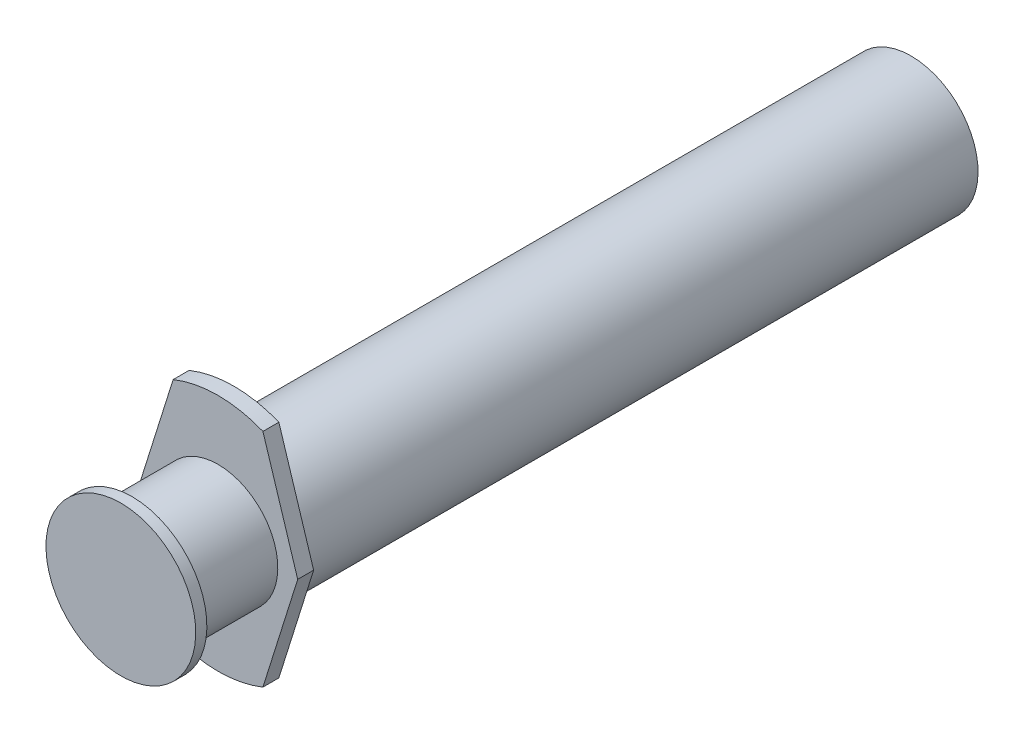
ISO-10303-21;
HEADER;
FILE_DESCRIPTION(('STEP AP214'),'2;1');
FILE_NAME('part.step','',(''),(''),'','','');
FILE_SCHEMA(('AUTOMOTIVE_DESIGN { 1 0 10303 214 1 1 1 1 }'));
ENDSEC;
DATA;
#1=APPLICATION_CONTEXT('core data for automotive mechanical design processes');
#2=APPLICATION_PROTOCOL_DEFINITION('international standard','automotive_design',2000,#1);
#3=PRODUCT_CONTEXT('',#1,'mechanical');
#4=PRODUCT('Part','Part','',(#3));
#5=PRODUCT_RELATED_PRODUCT_CATEGORY('part','',(#4));
#6=PRODUCT_DEFINITION_FORMATION('','',#4);
#7=PRODUCT_DEFINITION_CONTEXT('part definition',#1,'design');
#8=PRODUCT_DEFINITION('design','',#6,#7);
#9=PRODUCT_DEFINITION_SHAPE('','',#8);
#10=(LENGTH_UNIT() NAMED_UNIT(*) SI_UNIT(.MILLI.,.METRE.));
#11=(NAMED_UNIT(*) PLANE_ANGLE_UNIT() SI_UNIT($,.RADIAN.));
#12=(NAMED_UNIT(*) SI_UNIT($,.STERADIAN.) SOLID_ANGLE_UNIT());
#13=UNCERTAINTY_MEASURE_WITH_UNIT(LENGTH_MEASURE(1.E-05),#10,'distance_accuracy_value','');
#14=(GEOMETRIC_REPRESENTATION_CONTEXT(3) GLOBAL_UNCERTAINTY_ASSIGNED_CONTEXT((#13)) GLOBAL_UNIT_ASSIGNED_CONTEXT((#10,
#11,#12)) REPRESENTATION_CONTEXT('',''));
#15=CARTESIAN_POINT('',(0.,0.,0.));
#16=DIRECTION('',(0.,0.,1.));
#17=DIRECTION('',(1.,0.,0.));
#18=AXIS2_PLACEMENT_3D('',#15,#16,#17);
#19=CARTESIAN_POINT('',(0.,0.,-125.984));
#20=DIRECTION('',(0.,0.,-1.));
#21=DIRECTION('',(0.,1.,0.));
#22=AXIS2_PLACEMENT_3D('',#19,#20,#21);
#23=CYLINDRICAL_SURFACE('',#22,19.05);
#24=CARTESIAN_POINT('',(0.,0.,-18.034));
#25=DIRECTION('',(0.,0.,-1.));
#26=DIRECTION('',(0.,1.,0.));
#27=AXIS2_PLACEMENT_3D('',#24,#25,#26);
#28=CIRCLE('',#27,19.05);
#29=CARTESIAN_POINT('',(7.15625989359732,-17.6547569888484,-18.034));
#30=VERTEX_POINT('',#29);
#31=CARTESIAN_POINT('',(-7.15625989359732,-17.6547569888484,-18.034));
#32=VERTEX_POINT('',#31);
#33=EDGE_CURVE('E134',#30,#32,#28,.T.);
#34=ORIENTED_EDGE('',*,*,#33,.F.);
#35=DIRECTION('',(0.,0.,-1.));
#36=VECTOR('',#35,1.);
#37=CARTESIAN_POINT('',(7.15625989359733,-17.6547569888483,-125.984));
#38=LINE('',#37,#36);
#39=CARTESIAN_POINT('',(7.15625989359732,-17.6547569888483,-15.494));
#40=VERTEX_POINT('',#39);
#41=EDGE_CURVE('E82',#30,#40,#38,.F.);
#42=ORIENTED_EDGE('',*,*,#41,.T.);
#43=CARTESIAN_POINT('',(0.,0.,-15.494));
#44=DIRECTION('',(0.,0.,-1.));
#45=DIRECTION('',(0.,1.,0.));
#46=AXIS2_PLACEMENT_3D('',#43,#44,#45);
#47=CIRCLE('',#46,19.05);
#48=CARTESIAN_POINT('',(-7.15625989359732,-17.6547569888484,-15.494));
#49=VERTEX_POINT('',#48);
#50=EDGE_CURVE('E145',#40,#49,#47,.T.);
#51=ORIENTED_EDGE('',*,*,#50,.T.);
#52=DIRECTION('',(0.,0.,-1.));
#53=VECTOR('',#52,1.);
#54=CARTESIAN_POINT('',(-7.15625989359733,-17.6547569888483,-125.984));
#55=LINE('',#54,#53);
#56=EDGE_CURVE('E123',#49,#32,#55,.T.);
#57=ORIENTED_EDGE('',*,*,#56,.T.);
#58=EDGE_LOOP('',(#34,#42,#51,#57));
#59=FACE_BOUND('',#58,.T.);
#60=ADVANCED_FACE('F59',(#59),#23,.T.);
#61=CARTESIAN_POINT('',(0.,0.,0.));
#62=DIRECTION('',(0.,0.,1.));
#63=DIRECTION('',(0.,-1.,0.));
#64=AXIS2_PLACEMENT_3D('',#61,#62,#63);
#65=PLANE('',#64);
#66=CARTESIAN_POINT('',(0.,0.,0.));
#67=DIRECTION('',(0.,0.,-1.));
#68=DIRECTION('',(0.,1.,0.));
#69=AXIS2_PLACEMENT_3D('',#66,#67,#68);
#70=CIRCLE('',#69,11.938);
#71=CARTESIAN_POINT('',(0.,11.938,0.));
#72=VERTEX_POINT('',#71);
#73=EDGE_CURVE('E117',#72,#72,#70,.T.);
#74=ORIENTED_EDGE('',*,*,#73,.F.);
#75=EDGE_LOOP('',(#74));
#76=FACE_BOUND('',#75,.T.);
#77=ADVANCED_FACE('F61',(#76),#65,.T.);
#78=CARTESIAN_POINT('',(0.,0.,-125.984));
#79=DIRECTION('',(0.,0.,-1.));
#80=DIRECTION('',(0.,1.,0.));
#81=AXIS2_PLACEMENT_3D('',#78,#79,#80);
#82=CYLINDRICAL_SURFACE('',#81,11.938);
#83=ORIENTED_EDGE('',*,*,#73,.T.);
#84=EDGE_LOOP('',(#83));
#85=FACE_BOUND('',#84,.T.);
#86=CARTESIAN_POINT('',(0.,0.,-1.778));
#87=DIRECTION('',(0.,0.,-1.));
#88=DIRECTION('',(0.,1.,0.));
#89=AXIS2_PLACEMENT_3D('',#86,#87,#88);
#90=CIRCLE('',#89,11.938);
#91=CARTESIAN_POINT('',(0.,11.938,-1.778));
#92=VERTEX_POINT('',#91);
#93=EDGE_CURVE('E152',#92,#92,#90,.T.);
#94=ORIENTED_EDGE('',*,*,#93,.F.);
#95=EDGE_LOOP('',(#94));
#96=FACE_BOUND('',#95,.T.);
#97=ADVANCED_FACE('F158',(#85,#96),#82,.T.);
#98=CARTESIAN_POINT('',(0.,11.938,-1.778));
#99=DIRECTION('',(0.,0.,-1.));
#100=DIRECTION('',(0.,1.,0.));
#101=AXIS2_PLACEMENT_3D('',#98,#99,#100);
#102=PLANE('',#101);
#103=ORIENTED_EDGE('',*,*,#93,.T.);
#104=EDGE_LOOP('',(#103));
#105=FACE_BOUND('',#104,.T.);
#106=CARTESIAN_POINT('',(0.,0.,-1.778));
#107=DIRECTION('',(0.,0.,-1.));
#108=DIRECTION('',(0.,1.,0.));
#109=AXIS2_PLACEMENT_3D('',#106,#107,#108);
#110=CIRCLE('',#109,9.52499999999998);
#111=CARTESIAN_POINT('',(0.,9.52499999999998,-1.778));
#112=VERTEX_POINT('',#111);
#113=EDGE_CURVE('E149',#112,#112,#110,.T.);
#114=ORIENTED_EDGE('',*,*,#113,.F.);
#115=EDGE_LOOP('',(#114));
#116=FACE_BOUND('',#115,.T.);
#117=ADVANCED_FACE('F166',(#105,#116),#102,.T.);
#118=CARTESIAN_POINT('',(0.,0.,-125.984));
#119=DIRECTION('',(0.,0.,-1.));
#120=DIRECTION('',(0.,1.,0.));
#121=AXIS2_PLACEMENT_3D('',#118,#119,#120);
#122=CYLINDRICAL_SURFACE('',#121,9.52499999999998);
#123=ORIENTED_EDGE('',*,*,#113,.T.);
#124=EDGE_LOOP('',(#123));
#125=FACE_BOUND('',#124,.T.);
#126=CARTESIAN_POINT('',(0.,0.,-15.494));
#127=DIRECTION('',(0.,0.,-1.));
#128=DIRECTION('',(0.,1.,0.));
#129=AXIS2_PLACEMENT_3D('',#126,#127,#128);
#130=CIRCLE('',#129,9.52499999999998);
#131=CARTESIAN_POINT('',(0.,9.52499999999999,-15.494));
#132=VERTEX_POINT('',#131);
#133=EDGE_CURVE('E146',#132,#132,#130,.T.);
#134=ORIENTED_EDGE('',*,*,#133,.F.);
#135=EDGE_LOOP('',(#134));
#136=FACE_BOUND('',#135,.T.);
#137=ADVANCED_FACE('F181',(#125,#136),#122,.T.);
#138=CARTESIAN_POINT('',(0.,9.52499999999998,-15.494));
#139=DIRECTION('',(0.,0.,1.));
#140=DIRECTION('',(0.,-1.,0.));
#141=AXIS2_PLACEMENT_3D('',#138,#139,#140);
#142=PLANE('',#141);
#143=DIRECTION('',(0.299585701668378,-0.954069393365003,0.));
#144=VECTOR('',#143,1.);
#145=CARTESIAN_POINT('',(0.,40.4447916848445,-15.494));
#146=LINE('',#145,#144);
#147=CARTESIAN_POINT('',(7.15625989359732,17.6547569888484,-15.494));
#148=VERTEX_POINT('',#147);
#149=CARTESIAN_POINT('',(12.7,0.,-15.494));
#150=VERTEX_POINT('',#149);
#151=EDGE_CURVE('E122',#148,#150,#146,.T.);
#152=ORIENTED_EDGE('',*,*,#151,.F.);
#153=CARTESIAN_POINT('',(-7.15625989359732,17.6547569888484,-15.494));
#154=VERTEX_POINT('',#153);
#155=EDGE_CURVE('E137',#154,#148,#47,.T.);
#156=ORIENTED_EDGE('',*,*,#155,.F.);
#157=DIRECTION('',(0.299585701668378,0.954069393365003,0.));
#158=VECTOR('',#157,1.);
#159=CARTESIAN_POINT('',(-12.7,0.,-15.494));
#160=LINE('',#159,#158);
#161=CARTESIAN_POINT('',(-12.7,0.,-15.494));
#162=VERTEX_POINT('',#161);
#163=EDGE_CURVE('E190',#162,#154,#160,.T.);
#164=ORIENTED_EDGE('',*,*,#163,.F.);
#165=DIRECTION('',(0.299585701668378,-0.954069393365003,0.));
#166=VECTOR('',#165,1.);
#167=CARTESIAN_POINT('',(-12.7,0.,-15.494));
#168=LINE('',#167,#166);
#169=EDGE_CURVE('E194',#162,#49,#168,.T.);
#170=ORIENTED_EDGE('',*,*,#169,.T.);
#171=ORIENTED_EDGE('',*,*,#50,.F.);
#172=DIRECTION('',(0.299585701668378,0.954069393365003,0.));
#173=VECTOR('',#172,1.);
#174=CARTESIAN_POINT('',(0.,-40.4447916848445,-15.494));
#175=LINE('',#174,#173);
#176=EDGE_CURVE('E192',#40,#150,#175,.T.);
#177=ORIENTED_EDGE('',*,*,#176,.T.);
#178=EDGE_LOOP('',(#152,#156,#164,#170,#171,#177));
#179=FACE_BOUND('',#178,.T.);
#180=ORIENTED_EDGE('',*,*,#133,.T.);
#181=EDGE_LOOP('',(#180));
#182=FACE_BOUND('',#181,.T.);
#183=ADVANCED_FACE('F175',(#179,#182),#142,.T.);
#184=DIRECTION('',(0.,0.,-1.));
#185=VECTOR('',#184,1.);
#186=CARTESIAN_POINT('',(-7.1562598935973,17.6547569888484,-125.984));
#187=LINE('',#186,#185);
#188=CARTESIAN_POINT('',(-7.15625989359732,17.6547569888484,-18.034));
#189=VERTEX_POINT('',#188);
#190=EDGE_CURVE('E183',#154,#189,#187,.T.);
#191=ORIENTED_EDGE('',*,*,#190,.F.);
#192=ORIENTED_EDGE('',*,*,#155,.T.);
#193=DIRECTION('',(0.,0.,-1.));
#194=VECTOR('',#193,1.);
#195=CARTESIAN_POINT('',(7.15625989359731,17.6547569888484,-125.984));
#196=LINE('',#195,#194);
#197=CARTESIAN_POINT('',(7.15625989359732,17.6547569888484,-18.034));
#198=VERTEX_POINT('',#197);
#199=EDGE_CURVE('E185',#198,#148,#196,.F.);
#200=ORIENTED_EDGE('',*,*,#199,.F.);
#201=EDGE_CURVE('E130',#189,#198,#28,.T.);
#202=ORIENTED_EDGE('',*,*,#201,.F.);
#203=EDGE_LOOP('',(#191,#192,#200,#202));
#204=FACE_BOUND('',#203,.T.);
#205=ADVANCED_FACE('F169',(#204),#23,.T.);
#206=CARTESIAN_POINT('',(0.,19.05,-18.034));
#207=DIRECTION('',(0.,0.,-1.));
#208=DIRECTION('',(0.,1.,0.));
#209=AXIS2_PLACEMENT_3D('',#206,#207,#208);
#210=PLANE('',#209);
#211=DIRECTION('',(-0.299585701668378,0.954069393365003,0.));
#212=VECTOR('',#211,1.);
#213=CARTESIAN_POINT('',(6.11517807160692,20.9702166280043,-18.034));
#214=LINE('',#213,#212);
#215=CARTESIAN_POINT('',(12.7,0.,-18.034));
#216=VERTEX_POINT('',#215);
#217=EDGE_CURVE('E13',#216,#198,#214,.T.);
#218=ORIENTED_EDGE('',*,*,#217,.F.);
#219=DIRECTION('',(-0.299585701668378,-0.954069393365003,0.));
#220=VECTOR('',#219,1.);
#221=CARTESIAN_POINT('',(17.0051314752321,13.7102476922542,-18.034));
#222=LINE('',#221,#220);
#223=EDGE_CURVE('E67',#216,#30,#222,.T.);
#224=ORIENTED_EDGE('',*,*,#223,.T.);
#225=ORIENTED_EDGE('',*,*,#33,.T.);
#226=DIRECTION('',(0.299585701668378,-0.954069393365003,0.));
#227=VECTOR('',#226,1.);
#228=CARTESIAN_POINT('',(-12.7,0.,-18.034));
#229=LINE('',#228,#227);
#230=CARTESIAN_POINT('',(-12.7,0.,-18.034));
#231=VERTEX_POINT('',#230);
#232=EDGE_CURVE('E200',#231,#32,#229,.T.);
#233=ORIENTED_EDGE('',*,*,#232,.F.);
#234=DIRECTION('',(0.299585701668378,0.954069393365003,0.));
#235=VECTOR('',#234,1.);
#236=CARTESIAN_POINT('',(-12.7,0.,-18.034));
#237=LINE('',#236,#235);
#238=EDGE_CURVE('E74',#231,#189,#237,.T.);
#239=ORIENTED_EDGE('',*,*,#238,.T.);
#240=ORIENTED_EDGE('',*,*,#201,.T.);
#241=EDGE_LOOP('',(#218,#224,#225,#233,#239,#240));
#242=FACE_BOUND('',#241,.T.);
#243=CARTESIAN_POINT('',(0.,0.,-18.034));
#244=DIRECTION('',(0.,0.,-1.));
#245=DIRECTION('',(0.,1.,0.));
#246=AXIS2_PLACEMENT_3D('',#243,#244,#245);
#247=CIRCLE('',#246,10.668);
#248=CARTESIAN_POINT('',(0.,10.668,-18.034));
#249=VERTEX_POINT('',#248);
#250=EDGE_CURVE('E135',#249,#249,#247,.T.);
#251=ORIENTED_EDGE('',*,*,#250,.F.);
#252=EDGE_LOOP('',(#251));
#253=FACE_BOUND('',#252,.T.);
#254=ADVANCED_FACE('F127',(#242,#253),#210,.T.);
#255=CARTESIAN_POINT('',(0.,0.,-125.984));
#256=DIRECTION('',(0.,0.,-1.));
#257=DIRECTION('',(0.,1.,0.));
#258=AXIS2_PLACEMENT_3D('',#255,#256,#257);
#259=CYLINDRICAL_SURFACE('',#258,10.668);
#260=ORIENTED_EDGE('',*,*,#250,.T.);
#261=EDGE_LOOP('',(#260));
#262=FACE_BOUND('',#261,.T.);
#263=CARTESIAN_POINT('',(0.,0.,-125.984));
#264=DIRECTION('',(0.,0.,-1.));
#265=DIRECTION('',(0.,1.,0.));
#266=AXIS2_PLACEMENT_3D('',#263,#264,#265);
#267=CIRCLE('',#266,10.668);
#268=CARTESIAN_POINT('',(0.,10.668,-125.984));
#269=VERTEX_POINT('',#268);
#270=EDGE_CURVE('E139',#269,#269,#267,.T.);
#271=ORIENTED_EDGE('',*,*,#270,.F.);
#272=EDGE_LOOP('',(#271));
#273=FACE_BOUND('',#272,.T.);
#274=ADVANCED_FACE('F180',(#262,#273),#259,.T.);
#275=CARTESIAN_POINT('',(0.,10.668,-125.984));
#276=DIRECTION('',(0.,0.,-1.));
#277=DIRECTION('',(0.,1.,0.));
#278=AXIS2_PLACEMENT_3D('',#275,#276,#277);
#279=PLANE('',#278);
#280=ORIENTED_EDGE('',*,*,#270,.T.);
#281=EDGE_LOOP('',(#280));
#282=FACE_BOUND('',#281,.T.);
#283=ADVANCED_FACE('F208',(#282),#279,.T.);
#284=CARTESIAN_POINT('',(-12.7,0.,-18.034));
#285=DIRECTION('',(-0.954069393365003,-0.299585701668378,0.));
#286=DIRECTION('',(0.299585701668378,-0.954069393365003,0.));
#287=AXIS2_PLACEMENT_3D('',#284,#285,#286);
#288=PLANE('',#287);
#289=ORIENTED_EDGE('',*,*,#169,.F.);
#290=DIRECTION('',(0.,0.,1.));
#291=VECTOR('',#290,1.);
#292=CARTESIAN_POINT('',(-12.7,0.,-18.034));
#293=LINE('',#292,#291);
#294=EDGE_CURVE('E124',#231,#162,#293,.T.);
#295=ORIENTED_EDGE('',*,*,#294,.F.);
#296=ORIENTED_EDGE('',*,*,#232,.T.);
#297=ORIENTED_EDGE('',*,*,#56,.F.);
#298=EDGE_LOOP('',(#289,#295,#296,#297));
#299=FACE_BOUND('',#298,.T.);
#300=ADVANCED_FACE('F216',(#299),#288,.T.);
#301=CARTESIAN_POINT('',(-12.7,0.,-18.034));
#302=DIRECTION('',(0.954069393365003,-0.299585701668378,0.));
#303=DIRECTION('',(0.299585701668378,0.954069393365003,0.));
#304=AXIS2_PLACEMENT_3D('',#301,#302,#303);
#305=PLANE('',#304);
#306=ORIENTED_EDGE('',*,*,#190,.T.);
#307=ORIENTED_EDGE('',*,*,#238,.F.);
#308=ORIENTED_EDGE('',*,*,#294,.T.);
#309=ORIENTED_EDGE('',*,*,#163,.T.);
#310=EDGE_LOOP('',(#306,#307,#308,#309));
#311=FACE_BOUND('',#310,.T.);
#312=ADVANCED_FACE('F219',(#311),#305,.F.);
#313=CARTESIAN_POINT('',(0.,40.4447916848445,-18.034));
#314=DIRECTION('',(-0.954069393365003,-0.299585701668378,0.));
#315=DIRECTION('',(0.299585701668378,-0.954069393365003,0.));
#316=AXIS2_PLACEMENT_3D('',#313,#314,#315);
#317=PLANE('',#316);
#318=ORIENTED_EDGE('',*,*,#199,.T.);
#319=ORIENTED_EDGE('',*,*,#151,.T.);
#320=DIRECTION('',(0.,0.,1.));
#321=VECTOR('',#320,1.);
#322=CARTESIAN_POINT('',(12.7,0.,-18.034));
#323=LINE('',#322,#321);
#324=EDGE_CURVE('E111',#216,#150,#323,.T.);
#325=ORIENTED_EDGE('',*,*,#324,.F.);
#326=ORIENTED_EDGE('',*,*,#217,.T.);
#327=EDGE_LOOP('',(#318,#319,#325,#326));
#328=FACE_BOUND('',#327,.T.);
#329=ADVANCED_FACE('F119',(#328),#317,.F.);
#330=CARTESIAN_POINT('',(0.,-40.4447916848445,-18.034));
#331=DIRECTION('',(0.954069393365003,-0.299585701668378,0.));
#332=DIRECTION('',(0.299585701668378,0.954069393365003,0.));
#333=AXIS2_PLACEMENT_3D('',#330,#331,#332);
#334=PLANE('',#333);
#335=ORIENTED_EDGE('',*,*,#223,.F.);
#336=ORIENTED_EDGE('',*,*,#324,.T.);
#337=ORIENTED_EDGE('',*,*,#176,.F.);
#338=ORIENTED_EDGE('',*,*,#41,.F.);
#339=EDGE_LOOP('',(#335,#336,#337,#338));
#340=FACE_BOUND('',#339,.T.);
#341=ADVANCED_FACE('F110',(#340),#334,.T.);
#342=CLOSED_SHELL('',(#60,#77,#97,#117,#137,#183,#205,#254,#274,#283,#300,#312,#329,#341));
#343=MANIFOLD_SOLID_BREP('B2',#342);
#344=ADVANCED_BREP_SHAPE_REPRESENTATION('',(#18,#343),#14);
#345=SHAPE_DEFINITION_REPRESENTATION(#9,#344);
ENDSEC;
END-ISO-10303-21;
